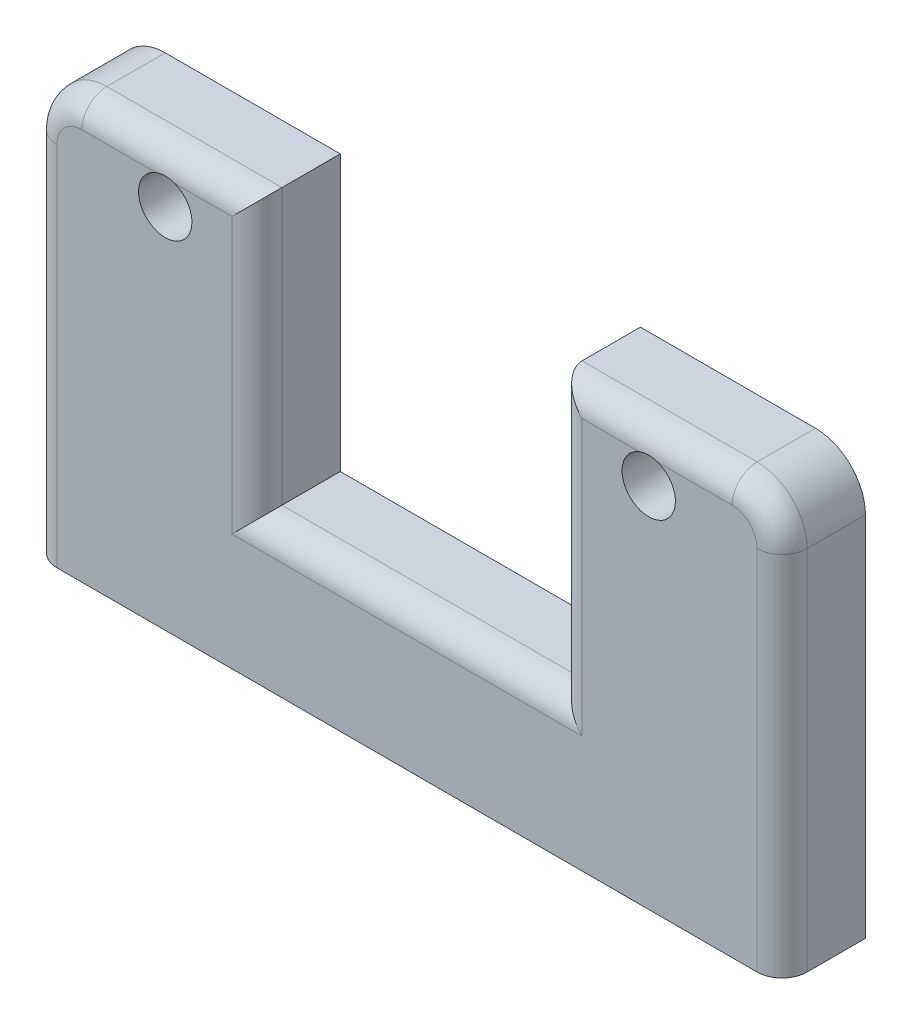
ISO-10303-21;
HEADER;
FILE_DESCRIPTION(('STEP AP214'),'2;1');
FILE_NAME('part.step','',(''),(''),'','','');
FILE_SCHEMA(('AUTOMOTIVE_DESIGN { 1 0 10303 214 1 1 1 1 }'));
ENDSEC;
DATA;
#1=APPLICATION_CONTEXT('core data for automotive mechanical design processes');
#2=APPLICATION_PROTOCOL_DEFINITION('international standard','automotive_design',2000,#1);
#3=PRODUCT_CONTEXT('',#1,'mechanical');
#4=PRODUCT('Part','Part','',(#3));
#5=PRODUCT_RELATED_PRODUCT_CATEGORY('part','',(#4));
#6=PRODUCT_DEFINITION_FORMATION('','',#4);
#7=PRODUCT_DEFINITION_CONTEXT('part definition',#1,'design');
#8=PRODUCT_DEFINITION('design','',#6,#7);
#9=PRODUCT_DEFINITION_SHAPE('','',#8);
#10=(LENGTH_UNIT() NAMED_UNIT(*) SI_UNIT(.MILLI.,.METRE.));
#11=(NAMED_UNIT(*) PLANE_ANGLE_UNIT() SI_UNIT($,.RADIAN.));
#12=(NAMED_UNIT(*) SI_UNIT($,.STERADIAN.) SOLID_ANGLE_UNIT());
#13=UNCERTAINTY_MEASURE_WITH_UNIT(LENGTH_MEASURE(1.E-05),#10,'distance_accuracy_value','');
#14=(GEOMETRIC_REPRESENTATION_CONTEXT(3) GLOBAL_UNCERTAINTY_ASSIGNED_CONTEXT((#13)) GLOBAL_UNIT_ASSIGNED_CONTEXT((#10,
#11,#12)) REPRESENTATION_CONTEXT('',''));
#15=CARTESIAN_POINT('',(0.,0.,0.));
#16=DIRECTION('',(0.,0.,1.));
#17=DIRECTION('',(1.,0.,0.));
#18=AXIS2_PLACEMENT_3D('',#15,#16,#17);
#19=CARTESIAN_POINT('',(241.119901235779,234.095927438084,5.));
#20=DIRECTION('',(0.,0.,1.));
#21=DIRECTION('',(1.,0.,0.));
#22=AXIS2_PLACEMENT_3D('',#19,#20,#21);
#23=PLANE('',#22);
#24=CARTESIAN_POINT('',(275.119901235779,234.095927438084,5.));
#25=DIRECTION('',(0.,0.,1.));
#26=DIRECTION('',(1.,0.,0.));
#27=AXIS2_PLACEMENT_3D('',#24,#25,#26);
#28=CIRCLE('',#27,1.59999999999999);
#29=CARTESIAN_POINT('',(274.563124799497,235.595927438084,5.));
#30=VERTEX_POINT('',#29);
#31=CARTESIAN_POINT('',(275.676677672062,235.595927438084,5.));
#32=VERTEX_POINT('',#31);
#33=EDGE_CURVE('E604',#30,#32,#28,.T.);
#34=ORIENTED_EDGE('',*,*,#33,.F.);
#35=DIRECTION('',(-1.,0.,0.));
#36=VECTOR('',#35,1.);
#37=CARTESIAN_POINT('',(269.619901235779,235.595927438084,5.));
#38=LINE('',#37,#36);
#39=CARTESIAN_POINT('',(271.119901235779,235.595927438084,5.));
#40=VERTEX_POINT('',#39);
#41=EDGE_CURVE('E249',#30,#40,#38,.T.);
#42=ORIENTED_EDGE('',*,*,#41,.T.);
#43=DIRECTION('',(0.,-1.,0.));
#44=VECTOR('',#43,1.);
#45=CARTESIAN_POINT('',(271.119901235779,220.595927438084,5.));
#46=LINE('',#45,#44);
#47=CARTESIAN_POINT('',(271.119901235779,219.095927438084,5.));
#48=VERTEX_POINT('',#47);
#49=EDGE_CURVE('E245',#40,#48,#46,.T.);
#50=ORIENTED_EDGE('',*,*,#49,.T.);
#51=DIRECTION('',(-1.,0.,0.));
#52=VECTOR('',#51,1.);
#53=CARTESIAN_POINT('',(251.619901235779,219.095927438084,5.));
#54=LINE('',#53,#52);
#55=CARTESIAN_POINT('',(250.119901235779,219.095927438084,5.));
#56=VERTEX_POINT('',#55);
#57=EDGE_CURVE('E243',#48,#56,#54,.T.);
#58=ORIENTED_EDGE('',*,*,#57,.T.);
#59=DIRECTION('',(0.,1.,0.));
#60=VECTOR('',#59,1.);
#61=CARTESIAN_POINT('',(250.119901235779,237.095927438084,5.));
#62=LINE('',#61,#60);
#63=CARTESIAN_POINT('',(250.119901235779,235.595927438084,5.));
#64=VERTEX_POINT('',#63);
#65=EDGE_CURVE('E241',#56,#64,#62,.T.);
#66=ORIENTED_EDGE('',*,*,#65,.T.);
#67=DIRECTION('',(-1.,0.,0.));
#68=VECTOR('',#67,1.);
#69=CARTESIAN_POINT('',(241.119901235779,235.595927438084,5.));
#70=LINE('',#69,#68);
#71=CARTESIAN_POINT('',(246.676677672062,235.595927438084,5.));
#72=VERTEX_POINT('',#71);
#73=EDGE_CURVE('E247',#64,#72,#70,.T.);
#74=ORIENTED_EDGE('',*,*,#73,.T.);
#75=CARTESIAN_POINT('',(246.11990123578,234.095927438084,5.));
#76=DIRECTION('',(0.,0.,1.));
#77=DIRECTION('',(1.,0.,0.));
#78=AXIS2_PLACEMENT_3D('',#75,#76,#77);
#79=CIRCLE('',#78,1.59999999999999);
#80=CARTESIAN_POINT('',(245.563124799497,235.595927438084,5.));
#81=VERTEX_POINT('',#80);
#82=EDGE_CURVE('E183',#81,#72,#79,.T.);
#83=ORIENTED_EDGE('',*,*,#82,.F.);
#84=DIRECTION('',(-1.,0.,0.));
#85=VECTOR('',#84,1.);
#86=CARTESIAN_POINT('',(241.119901235779,235.595927438084,5.));
#87=LINE('',#86,#85);
#88=CARTESIAN_POINT('',(241.119901235779,235.595927438084,5.));
#89=VERTEX_POINT('',#88);
#90=EDGE_CURVE('E232',#81,#89,#87,.T.);
#91=ORIENTED_EDGE('',*,*,#90,.T.);
#92=CARTESIAN_POINT('',(241.119901235779,234.095927438084,5.));
#93=DIRECTION('',(0.,0.,1.));
#94=DIRECTION('',(1.,0.,0.));
#95=AXIS2_PLACEMENT_3D('',#92,#93,#94);
#96=CIRCLE('',#95,1.5);
#97=CARTESIAN_POINT('',(239.619901235779,234.095927438084,5.));
#98=VERTEX_POINT('',#97);
#99=EDGE_CURVE('E230',#89,#98,#96,.T.);
#100=ORIENTED_EDGE('',*,*,#99,.T.);
#101=DIRECTION('',(0.,-1.,0.));
#102=VECTOR('',#101,1.);
#103=CARTESIAN_POINT('',(239.619901235779,212.095927438084,5.));
#104=LINE('',#103,#102);
#105=CARTESIAN_POINT('',(239.619901235779,212.095927438084,5.));
#106=VERTEX_POINT('',#105);
#107=EDGE_CURVE('E166',#98,#106,#104,.T.);
#108=ORIENTED_EDGE('',*,*,#107,.T.);
#109=DIRECTION('',(1.,0.,0.));
#110=VECTOR('',#109,1.);
#111=CARTESIAN_POINT('',(238.119901235779,212.095927438084,5.));
#112=LINE('',#111,#110);
#113=CARTESIAN_POINT('',(281.619901235779,212.095927438084,5.));
#114=VERTEX_POINT('',#113);
#115=EDGE_CURVE('E189',#106,#114,#112,.T.);
#116=ORIENTED_EDGE('',*,*,#115,.T.);
#117=DIRECTION('',(0.,1.,0.));
#118=VECTOR('',#117,1.);
#119=CARTESIAN_POINT('',(281.619901235779,234.095927438084,5.));
#120=LINE('',#119,#118);
#121=CARTESIAN_POINT('',(281.619901235779,234.095927438084,5.));
#122=VERTEX_POINT('',#121);
#123=EDGE_CURVE('E234',#114,#122,#120,.T.);
#124=ORIENTED_EDGE('',*,*,#123,.T.);
#125=CARTESIAN_POINT('',(280.11990123578,234.095927438084,5.));
#126=DIRECTION('',(0.,0.,1.));
#127=DIRECTION('',(1.,0.,0.));
#128=AXIS2_PLACEMENT_3D('',#125,#126,#127);
#129=CIRCLE('',#128,1.49999999999997);
#130=CARTESIAN_POINT('',(280.11990123578,235.595927438084,5.));
#131=VERTEX_POINT('',#130);
#132=EDGE_CURVE('E236',#122,#131,#129,.T.);
#133=ORIENTED_EDGE('',*,*,#132,.T.);
#134=DIRECTION('',(-1.,0.,0.));
#135=VECTOR('',#134,1.);
#136=CARTESIAN_POINT('',(269.619901235779,235.595927438084,5.));
#137=LINE('',#136,#135);
#138=EDGE_CURVE('E238',#131,#32,#137,.T.);
#139=ORIENTED_EDGE('',*,*,#138,.T.);
#140=EDGE_LOOP('',(#34,#42,#50,#58,#66,#74,#83,#91,#100,#108,#116,#124,#133,#139));
#141=FACE_BOUND('',#140,.T.);
#142=ADVANCED_FACE('F35',(#141),#23,.T.);
#143=CARTESIAN_POINT('',(241.119901235779,234.095927438084,0.));
#144=DIRECTION('',(0.,0.,1.));
#145=DIRECTION('',(1.,0.,0.));
#146=AXIS2_PLACEMENT_3D('',#143,#144,#145);
#147=PLANE('',#146);
#148=CARTESIAN_POINT('',(241.119901235779,234.095927438084,0.));
#149=DIRECTION('',(0.,0.,1.));
#150=DIRECTION('',(1.,0.,0.));
#151=AXIS2_PLACEMENT_3D('',#148,#149,#150);
#152=CIRCLE('',#151,3.);
#153=CARTESIAN_POINT('',(241.119901235779,237.095927438084,0.));
#154=VERTEX_POINT('',#153);
#155=CARTESIAN_POINT('',(238.119901235779,234.095927438084,0.));
#156=VERTEX_POINT('',#155);
#157=EDGE_CURVE('E174',#154,#156,#152,.T.);
#158=ORIENTED_EDGE('',*,*,#157,.F.);
#159=DIRECTION('',(-1.,0.,0.));
#160=VECTOR('',#159,1.);
#161=CARTESIAN_POINT('',(241.119901235779,237.095927438084,0.));
#162=LINE('',#161,#160);
#163=CARTESIAN_POINT('',(251.619901235779,237.095927438084,0.));
#164=VERTEX_POINT('',#163);
#165=EDGE_CURVE('E211',#164,#154,#162,.T.);
#166=ORIENTED_EDGE('',*,*,#165,.F.);
#167=DIRECTION('',(0.,1.,0.));
#168=VECTOR('',#167,1.);
#169=CARTESIAN_POINT('',(251.619901235779,237.095927438084,0.));
#170=LINE('',#169,#168);
#171=CARTESIAN_POINT('',(251.619901235779,220.595927438084,0.));
#172=VERTEX_POINT('',#171);
#173=EDGE_CURVE('E208',#172,#164,#170,.T.);
#174=ORIENTED_EDGE('',*,*,#173,.F.);
#175=DIRECTION('',(-1.,0.,0.));
#176=VECTOR('',#175,1.);
#177=CARTESIAN_POINT('',(251.619901235779,220.595927438084,0.));
#178=LINE('',#177,#176);
#179=CARTESIAN_POINT('',(269.619901235779,220.595927438084,0.));
#180=VERTEX_POINT('',#179);
#181=EDGE_CURVE('E205',#180,#172,#178,.T.);
#182=ORIENTED_EDGE('',*,*,#181,.F.);
#183=DIRECTION('',(0.,-1.,0.));
#184=VECTOR('',#183,1.);
#185=CARTESIAN_POINT('',(269.619901235779,237.095927438084,0.));
#186=LINE('',#185,#184);
#187=CARTESIAN_POINT('',(269.619901235779,237.095927438084,0.));
#188=VERTEX_POINT('',#187);
#189=EDGE_CURVE('E202',#188,#180,#186,.T.);
#190=ORIENTED_EDGE('',*,*,#189,.F.);
#191=DIRECTION('',(-1.,0.,0.));
#192=VECTOR('',#191,1.);
#193=CARTESIAN_POINT('',(280.11990123578,237.095927438084,0.));
#194=LINE('',#193,#192);
#195=CARTESIAN_POINT('',(280.11990123578,237.095927438084,0.));
#196=VERTEX_POINT('',#195);
#197=EDGE_CURVE('E199',#196,#188,#194,.T.);
#198=ORIENTED_EDGE('',*,*,#197,.F.);
#199=CARTESIAN_POINT('',(280.11990123578,234.095927438084,0.));
#200=DIRECTION('',(0.,0.,1.));
#201=DIRECTION('',(1.,0.,0.));
#202=AXIS2_PLACEMENT_3D('',#199,#200,#201);
#203=CIRCLE('',#202,2.99999999999998);
#204=CARTESIAN_POINT('',(283.119901235779,234.095927438084,0.));
#205=VERTEX_POINT('',#204);
#206=EDGE_CURVE('E196',#205,#196,#203,.T.);
#207=ORIENTED_EDGE('',*,*,#206,.F.);
#208=DIRECTION('',(0.,1.,0.));
#209=VECTOR('',#208,1.);
#210=CARTESIAN_POINT('',(283.119901235779,212.095927438084,0.));
#211=LINE('',#210,#209);
#212=CARTESIAN_POINT('',(283.119901235779,212.095927438084,0.));
#213=VERTEX_POINT('',#212);
#214=EDGE_CURVE('E193',#213,#205,#211,.T.);
#215=ORIENTED_EDGE('',*,*,#214,.F.);
#216=DIRECTION('',(1.,0.,0.));
#217=VECTOR('',#216,1.);
#218=CARTESIAN_POINT('',(238.119901235779,212.095927438084,0.));
#219=LINE('',#218,#217);
#220=CARTESIAN_POINT('',(238.119901235779,212.095927438084,0.));
#221=VERTEX_POINT('',#220);
#222=EDGE_CURVE('E177',#221,#213,#219,.T.);
#223=ORIENTED_EDGE('',*,*,#222,.F.);
#224=DIRECTION('',(0.,-1.,0.));
#225=VECTOR('',#224,1.);
#226=CARTESIAN_POINT('',(238.119901235779,212.095927438084,0.));
#227=LINE('',#226,#225);
#228=EDGE_CURVE('E160',#156,#221,#227,.T.);
#229=ORIENTED_EDGE('',*,*,#228,.F.);
#230=EDGE_LOOP('',(#158,#166,#174,#182,#190,#198,#207,#215,#223,#229));
#231=FACE_BOUND('',#230,.T.);
#232=CARTESIAN_POINT('',(246.11990123578,234.095927438084,0.));
#233=DIRECTION('',(0.,0.,1.));
#234=DIRECTION('',(1.,0.,0.));
#235=AXIS2_PLACEMENT_3D('',#232,#233,#234);
#236=CIRCLE('',#235,1.59999999999999);
#237=CARTESIAN_POINT('',(247.71990123578,234.095927438084,0.));
#238=VERTEX_POINT('',#237);
#239=EDGE_CURVE('E186',#238,#238,#236,.T.);
#240=ORIENTED_EDGE('',*,*,#239,.T.);
#241=EDGE_LOOP('',(#240));
#242=FACE_BOUND('',#241,.T.);
#243=CARTESIAN_POINT('',(275.119901235779,234.095927438084,0.));
#244=DIRECTION('',(0.,0.,1.));
#245=DIRECTION('',(1.,0.,0.));
#246=AXIS2_PLACEMENT_3D('',#243,#244,#245);
#247=CIRCLE('',#246,1.59999999999999);
#248=CARTESIAN_POINT('',(276.71990123578,234.095927438084,0.));
#249=VERTEX_POINT('',#248);
#250=EDGE_CURVE('E606',#249,#249,#247,.T.);
#251=ORIENTED_EDGE('',*,*,#250,.T.);
#252=EDGE_LOOP('',(#251));
#253=FACE_BOUND('',#252,.T.);
#254=ADVANCED_FACE('F171',(#231,#242,#253),#147,.F.);
#255=CARTESIAN_POINT('',(241.119901235779,234.095927438084,5.));
#256=DIRECTION('',(0.,0.,-1.));
#257=DIRECTION('',(-1.,0.,0.));
#258=AXIS2_PLACEMENT_3D('',#255,#256,#257);
#259=CYLINDRICAL_SURFACE('',#258,3.);
#260=DIRECTION('',(0.,0.,-1.));
#261=VECTOR('',#260,1.);
#262=CARTESIAN_POINT('',(238.119901235779,234.095927438084,5.));
#263=LINE('',#262,#261);
#264=CARTESIAN_POINT('',(238.119901235779,234.095927438084,3.5));
#265=VERTEX_POINT('',#264);
#266=EDGE_CURVE('E157',#265,#156,#263,.T.);
#267=ORIENTED_EDGE('',*,*,#266,.F.);
#268=CARTESIAN_POINT('',(241.119901235779,234.095927438084,3.5));
#269=DIRECTION('',(0.,0.,1.));
#270=DIRECTION('',(1.,0.,0.));
#271=AXIS2_PLACEMENT_3D('',#268,#269,#270);
#272=CIRCLE('',#271,3.);
#273=CARTESIAN_POINT('',(241.119901235779,237.095927438084,3.5));
#274=VERTEX_POINT('',#273);
#275=EDGE_CURVE('E535',#265,#274,#272,.F.);
#276=ORIENTED_EDGE('',*,*,#275,.T.);
#277=DIRECTION('',(0.,0.,-1.));
#278=VECTOR('',#277,1.);
#279=CARTESIAN_POINT('',(241.119901235779,237.095927438084,5.));
#280=LINE('',#279,#278);
#281=EDGE_CURVE('E181',#274,#154,#280,.T.);
#282=ORIENTED_EDGE('',*,*,#281,.T.);
#283=ORIENTED_EDGE('',*,*,#157,.T.);
#284=EDGE_LOOP('',(#267,#276,#282,#283));
#285=FACE_BOUND('',#284,.T.);
#286=ADVANCED_FACE('F179',(#285),#259,.T.);
#287=CARTESIAN_POINT('',(238.119901235779,212.095927438084,5.));
#288=DIRECTION('',(1.,0.,0.));
#289=DIRECTION('',(0.,0.,-1.));
#290=AXIS2_PLACEMENT_3D('',#287,#288,#289);
#291=PLANE('',#290);
#292=DIRECTION('',(0.,0.,-1.));
#293=VECTOR('',#292,1.);
#294=CARTESIAN_POINT('',(238.119901235779,212.095927438084,5.));
#295=LINE('',#294,#293);
#296=CARTESIAN_POINT('',(238.119901235779,212.095927438084,3.5));
#297=VERTEX_POINT('',#296);
#298=EDGE_CURVE('E167',#297,#221,#295,.T.);
#299=ORIENTED_EDGE('',*,*,#298,.F.);
#300=DIRECTION('',(0.,-1.,0.));
#301=VECTOR('',#300,1.);
#302=CARTESIAN_POINT('',(238.119901235779,234.095927438084,3.5));
#303=LINE('',#302,#301);
#304=EDGE_CURVE('E11',#297,#265,#303,.F.);
#305=ORIENTED_EDGE('',*,*,#304,.T.);
#306=ORIENTED_EDGE('',*,*,#266,.T.);
#307=ORIENTED_EDGE('',*,*,#228,.T.);
#308=EDGE_LOOP('',(#299,#305,#306,#307));
#309=FACE_BOUND('',#308,.T.);
#310=ADVANCED_FACE('F159',(#309),#291,.F.);
#311=CARTESIAN_POINT('',(238.119901235779,212.095927438084,5.));
#312=DIRECTION('',(0.,1.,0.));
#313=DIRECTION('',(0.,0.,1.));
#314=AXIS2_PLACEMENT_3D('',#311,#312,#313);
#315=PLANE('',#314);
#316=CARTESIAN_POINT('',(279.86990123578,212.095927438084,2.5));
#317=DIRECTION('',(0.,-1.,0.));
#318=DIRECTION('',(0.,0.,-1.));
#319=AXIS2_PLACEMENT_3D('',#316,#317,#318);
#320=CIRCLE('',#319,1.25000000000001);
#321=CARTESIAN_POINT('',(279.86990123578,212.095927438084,1.24999999999999));
#322=VERTEX_POINT('',#321);
#323=EDGE_CURVE('E537',#322,#322,#320,.T.);
#324=ORIENTED_EDGE('',*,*,#323,.F.);
#325=EDGE_LOOP('',(#324));
#326=FACE_BOUND('',#325,.T.);
#327=CARTESIAN_POINT('',(241.36990123578,212.095927438084,2.5));
#328=DIRECTION('',(0.,-1.,0.));
#329=DIRECTION('',(0.,0.,-1.));
#330=AXIS2_PLACEMENT_3D('',#327,#328,#329);
#331=CIRCLE('',#330,1.25000000000001);
#332=CARTESIAN_POINT('',(241.36990123578,212.095927438084,1.24999999999999));
#333=VERTEX_POINT('',#332);
#334=EDGE_CURVE('E613',#333,#333,#331,.T.);
#335=ORIENTED_EDGE('',*,*,#334,.F.);
#336=EDGE_LOOP('',(#335));
#337=FACE_BOUND('',#336,.T.);
#338=DIRECTION('',(0.,0.,-1.));
#339=VECTOR('',#338,1.);
#340=CARTESIAN_POINT('',(283.119901235779,212.095927438084,5.));
#341=LINE('',#340,#339);
#342=CARTESIAN_POINT('',(283.119901235779,212.095927438084,3.5));
#343=VERTEX_POINT('',#342);
#344=EDGE_CURVE('E226',#343,#213,#341,.T.);
#345=ORIENTED_EDGE('',*,*,#344,.F.);
#346=CARTESIAN_POINT('',(281.619901235779,212.095927438084,3.5));
#347=DIRECTION('',(0.,1.,0.));
#348=DIRECTION('',(0.,0.,1.));
#349=AXIS2_PLACEMENT_3D('',#346,#347,#348);
#350=CIRCLE('',#349,1.5);
#351=EDGE_CURVE('E44',#343,#114,#350,.F.);
#352=ORIENTED_EDGE('',*,*,#351,.T.);
#353=ORIENTED_EDGE('',*,*,#115,.F.);
#354=CARTESIAN_POINT('',(239.619901235779,212.095927438084,3.5));
#355=DIRECTION('',(0.,1.,0.));
#356=DIRECTION('',(0.,0.,1.));
#357=AXIS2_PLACEMENT_3D('',#354,#355,#356);
#358=CIRCLE('',#357,1.5);
#359=EDGE_CURVE('E52',#106,#297,#358,.F.);
#360=ORIENTED_EDGE('',*,*,#359,.T.);
#361=ORIENTED_EDGE('',*,*,#298,.T.);
#362=ORIENTED_EDGE('',*,*,#222,.T.);
#363=EDGE_LOOP('',(#345,#352,#353,#360,#361,#362));
#364=FACE_BOUND('',#363,.T.);
#365=ADVANCED_FACE('F342',(#326,#337,#364),#315,.F.);
#366=CARTESIAN_POINT('',(283.119901235779,212.095927438084,5.));
#367=DIRECTION('',(-1.,0.,0.));
#368=DIRECTION('',(0.,0.,1.));
#369=AXIS2_PLACEMENT_3D('',#366,#367,#368);
#370=PLANE('',#369);
#371=DIRECTION('',(0.,0.,-1.));
#372=VECTOR('',#371,1.);
#373=CARTESIAN_POINT('',(283.119901235779,234.095927438084,5.));
#374=LINE('',#373,#372);
#375=CARTESIAN_POINT('',(283.119901235779,234.095927438084,3.5));
#376=VERTEX_POINT('',#375);
#377=EDGE_CURVE('E224',#376,#205,#374,.T.);
#378=ORIENTED_EDGE('',*,*,#377,.F.);
#379=DIRECTION('',(0.,1.,0.));
#380=VECTOR('',#379,1.);
#381=CARTESIAN_POINT('',(283.119901235779,212.095927438084,3.5));
#382=LINE('',#381,#380);
#383=EDGE_CURVE('E60',#376,#343,#382,.F.);
#384=ORIENTED_EDGE('',*,*,#383,.T.);
#385=ORIENTED_EDGE('',*,*,#344,.T.);
#386=ORIENTED_EDGE('',*,*,#214,.T.);
#387=EDGE_LOOP('',(#378,#384,#385,#386));
#388=FACE_BOUND('',#387,.T.);
#389=ADVANCED_FACE('F338',(#388),#370,.F.);
#390=CARTESIAN_POINT('',(280.11990123578,234.095927438084,5.));
#391=DIRECTION('',(0.,0.,-1.));
#392=DIRECTION('',(-1.,0.,0.));
#393=AXIS2_PLACEMENT_3D('',#390,#391,#392);
#394=CYLINDRICAL_SURFACE('',#393,2.99999999999998);
#395=DIRECTION('',(0.,0.,-1.));
#396=VECTOR('',#395,1.);
#397=CARTESIAN_POINT('',(280.11990123578,237.095927438084,5.));
#398=LINE('',#397,#396);
#399=CARTESIAN_POINT('',(280.11990123578,237.095927438084,3.5));
#400=VERTEX_POINT('',#399);
#401=EDGE_CURVE('E222',#400,#196,#398,.T.);
#402=ORIENTED_EDGE('',*,*,#401,.F.);
#403=CARTESIAN_POINT('',(280.11990123578,234.095927438084,3.5));
#404=DIRECTION('',(0.,0.,1.));
#405=DIRECTION('',(1.,0.,0.));
#406=AXIS2_PLACEMENT_3D('',#403,#404,#405);
#407=CIRCLE('',#406,2.99999999999998);
#408=EDGE_CURVE('E303',#400,#376,#407,.F.);
#409=ORIENTED_EDGE('',*,*,#408,.T.);
#410=ORIENTED_EDGE('',*,*,#377,.T.);
#411=ORIENTED_EDGE('',*,*,#206,.T.);
#412=EDGE_LOOP('',(#402,#409,#410,#411));
#413=FACE_BOUND('',#412,.T.);
#414=ADVANCED_FACE('F334',(#413),#394,.T.);
#415=CARTESIAN_POINT('',(280.11990123578,237.095927438084,5.));
#416=DIRECTION('',(0.,-1.,0.));
#417=DIRECTION('',(1.,0.,0.));
#418=AXIS2_PLACEMENT_3D('',#415,#416,#417);
#419=PLANE('',#418);
#420=DIRECTION('',(0.,0.,-1.));
#421=VECTOR('',#420,1.);
#422=CARTESIAN_POINT('',(269.619901235779,237.095927438084,5.));
#423=LINE('',#422,#421);
#424=CARTESIAN_POINT('',(269.619901235779,237.095927438084,3.5));
#425=VERTEX_POINT('',#424);
#426=EDGE_CURVE('E220',#425,#188,#423,.T.);
#427=ORIENTED_EDGE('',*,*,#426,.F.);
#428=DIRECTION('',(-1.,0.,0.));
#429=VECTOR('',#428,1.);
#430=CARTESIAN_POINT('',(280.11990123578,237.095927438084,3.5));
#431=LINE('',#430,#429);
#432=EDGE_CURVE('E258',#425,#400,#431,.F.);
#433=ORIENTED_EDGE('',*,*,#432,.T.);
#434=ORIENTED_EDGE('',*,*,#401,.T.);
#435=ORIENTED_EDGE('',*,*,#197,.T.);
#436=EDGE_LOOP('',(#427,#433,#434,#435));
#437=FACE_BOUND('',#436,.T.);
#438=ADVANCED_FACE('F330',(#437),#419,.F.);
#439=CARTESIAN_POINT('',(269.619901235779,237.095927438084,5.));
#440=DIRECTION('',(1.,0.,0.));
#441=DIRECTION('',(0.,0.,-1.));
#442=AXIS2_PLACEMENT_3D('',#439,#440,#441);
#443=PLANE('',#442);
#444=DIRECTION('',(0.,0.,-1.));
#445=VECTOR('',#444,1.);
#446=CARTESIAN_POINT('',(269.619901235779,220.595927438084,5.));
#447=LINE('',#446,#445);
#448=CARTESIAN_POINT('',(269.619901235779,220.595927438084,3.5));
#449=VERTEX_POINT('',#448);
#450=EDGE_CURVE('E218',#449,#180,#447,.T.);
#451=ORIENTED_EDGE('',*,*,#450,.F.);
#452=DIRECTION('',(0.,-1.,0.));
#453=VECTOR('',#452,1.);
#454=CARTESIAN_POINT('',(269.619901235779,237.095927438084,3.5));
#455=LINE('',#454,#453);
#456=EDGE_CURVE('E570',#449,#425,#455,.F.);
#457=ORIENTED_EDGE('',*,*,#456,.T.);
#458=ORIENTED_EDGE('',*,*,#426,.T.);
#459=ORIENTED_EDGE('',*,*,#189,.T.);
#460=EDGE_LOOP('',(#451,#457,#458,#459));
#461=FACE_BOUND('',#460,.T.);
#462=ADVANCED_FACE('F326',(#461),#443,.F.);
#463=CARTESIAN_POINT('',(251.619901235779,220.595927438084,5.));
#464=DIRECTION('',(0.,-1.,0.));
#465=DIRECTION('',(0.,0.,-1.));
#466=AXIS2_PLACEMENT_3D('',#463,#464,#465);
#467=PLANE('',#466);
#468=DIRECTION('',(0.,0.,-1.));
#469=VECTOR('',#468,1.);
#470=CARTESIAN_POINT('',(251.619901235779,220.595927438084,5.));
#471=LINE('',#470,#469);
#472=CARTESIAN_POINT('',(251.619901235779,220.595927438084,3.5));
#473=VERTEX_POINT('',#472);
#474=EDGE_CURVE('E216',#473,#172,#471,.T.);
#475=ORIENTED_EDGE('',*,*,#474,.F.);
#476=DIRECTION('',(-1.,0.,0.));
#477=VECTOR('',#476,1.);
#478=CARTESIAN_POINT('',(269.619901235779,220.595927438084,3.5));
#479=LINE('',#478,#477);
#480=EDGE_CURVE('E568',#473,#449,#479,.F.);
#481=ORIENTED_EDGE('',*,*,#480,.T.);
#482=ORIENTED_EDGE('',*,*,#450,.T.);
#483=ORIENTED_EDGE('',*,*,#181,.T.);
#484=EDGE_LOOP('',(#475,#481,#482,#483));
#485=FACE_BOUND('',#484,.T.);
#486=ADVANCED_FACE('F322',(#485),#467,.F.);
#487=CARTESIAN_POINT('',(251.619901235779,237.095927438084,5.));
#488=DIRECTION('',(-1.,0.,0.));
#489=DIRECTION('',(0.,0.,1.));
#490=AXIS2_PLACEMENT_3D('',#487,#488,#489);
#491=PLANE('',#490);
#492=DIRECTION('',(0.,0.,-1.));
#493=VECTOR('',#492,1.);
#494=CARTESIAN_POINT('',(251.619901235779,237.095927438084,5.));
#495=LINE('',#494,#493);
#496=CARTESIAN_POINT('',(251.619901235779,237.095927438084,3.5));
#497=VERTEX_POINT('',#496);
#498=EDGE_CURVE('E214',#497,#164,#495,.T.);
#499=ORIENTED_EDGE('',*,*,#498,.F.);
#500=DIRECTION('',(0.,1.,0.));
#501=VECTOR('',#500,1.);
#502=CARTESIAN_POINT('',(251.619901235779,220.595927438084,3.5));
#503=LINE('',#502,#501);
#504=EDGE_CURVE('E566',#497,#473,#503,.F.);
#505=ORIENTED_EDGE('',*,*,#504,.T.);
#506=ORIENTED_EDGE('',*,*,#474,.T.);
#507=ORIENTED_EDGE('',*,*,#173,.T.);
#508=EDGE_LOOP('',(#499,#505,#506,#507));
#509=FACE_BOUND('',#508,.T.);
#510=ADVANCED_FACE('F318',(#509),#491,.F.);
#511=CARTESIAN_POINT('',(241.119901235779,237.095927438084,5.));
#512=DIRECTION('',(0.,-1.,0.));
#513=DIRECTION('',(0.,0.,-1.));
#514=AXIS2_PLACEMENT_3D('',#511,#512,#513);
#515=PLANE('',#514);
#516=ORIENTED_EDGE('',*,*,#281,.F.);
#517=DIRECTION('',(-1.,0.,0.));
#518=VECTOR('',#517,1.);
#519=CARTESIAN_POINT('',(251.619901235779,237.095927438084,3.5));
#520=LINE('',#519,#518);
#521=EDGE_CURVE('E302',#274,#497,#520,.F.);
#522=ORIENTED_EDGE('',*,*,#521,.T.);
#523=ORIENTED_EDGE('',*,*,#498,.T.);
#524=ORIENTED_EDGE('',*,*,#165,.T.);
#525=EDGE_LOOP('',(#516,#522,#523,#524));
#526=FACE_BOUND('',#525,.T.);
#527=ADVANCED_FACE('F309',(#526),#515,.F.);
#528=CARTESIAN_POINT('',(246.11990123578,234.095927438084,5.));
#529=DIRECTION('',(0.,0.,-1.));
#530=DIRECTION('',(-1.,0.,0.));
#531=AXIS2_PLACEMENT_3D('',#528,#529,#530);
#532=CYLINDRICAL_SURFACE('',#531,1.59999999999999);
#533=ORIENTED_EDGE('',*,*,#82,.T.);
#534=CARTESIAN_POINT('',(246.676677672062,235.595927438084,5.));
#535=CARTESIAN_POINT('',(246.633901419943,235.611810710577,4.99998628050601));
#536=CARTESIAN_POINT('',(246.59044413893,235.625854111346,4.99974708781376));
#537=CARTESIAN_POINT('',(246.502496808462,235.650178895589,4.99907168670408));
#538=CARTESIAN_POINT('',(246.458006902506,235.660460798492,4.99863550550759));
#539=CARTESIAN_POINT('',(246.369615588009,235.67694161627,4.99783177091119));
#540=CARTESIAN_POINT('',(246.325734679962,235.683250554361,4.99746259085897));
#541=CARTESIAN_POINT('',(246.237599281442,235.692207213984,4.99691380136298));
#542=CARTESIAN_POINT('',(246.193344781574,235.694854843169,4.99673419670081));
#543=CARTESIAN_POINT('',(246.10006276081,235.696554454611,4.99662147929318));
#544=CARTESIAN_POINT('',(246.051027177782,235.695194977928,4.99671655185866));
#545=CARTESIAN_POINT('',(245.953282580389,235.687983006653,4.99717647720257));
#546=CARTESIAN_POINT('',(245.904573622961,235.682129748242,4.99754137584354));
#547=CARTESIAN_POINT('',(245.806296112515,235.665708757105,4.99840079163312));
#548=CARTESIAN_POINT('',(245.756752548449,235.654991250043,4.998899202734));
#549=CARTESIAN_POINT('',(245.658900985428,235.628914487378,4.99968823976701));
#550=CARTESIAN_POINT('',(245.610592991187,235.61355521407,4.99997886490658));
#551=CARTESIAN_POINT('',(245.563124799497,235.595927438084,5.));
#552=B_SPLINE_CURVE_WITH_KNOTS('',3,(#534,#535,#536,#537,#538,#539,#540,#541,#542,#543,#544,
#545,#546,#547,#548,#549,#550,#551),.UNSPECIFIED.,.F.,.F.,(4,2,2,2,2,2,2,2,4),(0.,
0.136845221079914,0.273671537926004,0.406519543081961,0.539370898943245,0.686322764778767,
0.83329961387208,0.985146088564049,1.13699314243398),.UNSPECIFIED.);
#553=EDGE_CURVE('E297',#72,#81,#552,.T.);
#554=ORIENTED_EDGE('',*,*,#553,.T.);
#555=EDGE_LOOP('',(#533,#554));
#556=FACE_BOUND('',#555,.T.);
#557=ORIENTED_EDGE('',*,*,#239,.F.);
#558=EDGE_LOOP('',(#557));
#559=FACE_BOUND('',#558,.T.);
#560=ADVANCED_FACE('F305',(#556,#559),#532,.F.);
#561=CARTESIAN_POINT('',(275.119901235779,234.095927438084,5.));
#562=DIRECTION('',(0.,0.,-1.));
#563=DIRECTION('',(-1.,0.,0.));
#564=AXIS2_PLACEMENT_3D('',#561,#562,#563);
#565=CYLINDRICAL_SURFACE('',#564,1.59999999999999);
#566=ORIENTED_EDGE('',*,*,#33,.T.);
#567=CARTESIAN_POINT('',(275.676677672062,235.595927438084,5.));
#568=CARTESIAN_POINT('',(275.633901419943,235.611810710577,4.99998628050601));
#569=CARTESIAN_POINT('',(275.59044413893,235.625854111346,4.99974708781376));
#570=CARTESIAN_POINT('',(275.502496808462,235.650178895589,4.99907168670408));
#571=CARTESIAN_POINT('',(275.458006902506,235.660460798492,4.99863550550759));
#572=CARTESIAN_POINT('',(275.369615588009,235.67694161627,4.99783177091119));
#573=CARTESIAN_POINT('',(275.325734679962,235.683250554361,4.99746259085897));
#574=CARTESIAN_POINT('',(275.237599281442,235.692207213984,4.99691380136298));
#575=CARTESIAN_POINT('',(275.193344781574,235.694854843169,4.99673419670081));
#576=CARTESIAN_POINT('',(275.10006276081,235.696554454611,4.99662147929318));
#577=CARTESIAN_POINT('',(275.051027177782,235.695194977928,4.99671655185866));
#578=CARTESIAN_POINT('',(274.953282580389,235.687983006653,4.99717647720257));
#579=CARTESIAN_POINT('',(274.904573622961,235.682129748242,4.99754137584354));
#580=CARTESIAN_POINT('',(274.806296112515,235.665708757105,4.99840079163312));
#581=CARTESIAN_POINT('',(274.756752548449,235.654991250043,4.998899202734));
#582=CARTESIAN_POINT('',(274.658900985428,235.628914487378,4.99968823976701));
#583=CARTESIAN_POINT('',(274.610592991187,235.61355521407,4.99997886490658));
#584=CARTESIAN_POINT('',(274.563124799497,235.595927438084,5.));
#585=B_SPLINE_CURVE_WITH_KNOTS('',3,(#567,#568,#569,#570,#571,#572,#573,#574,#575,#576,#577,
#578,#579,#580,#581,#582,#583,#584),.UNSPECIFIED.,.F.,.F.,(4,2,2,2,2,2,2,2,4),(0.,
0.136845221079941,0.27367153792595,0.406519543081906,0.539370898943218,0.686322764778795,
0.833299613872026,0.985146088563989,1.1369931424339),.UNSPECIFIED.);
#586=EDGE_CURVE('E251',#32,#30,#585,.T.);
#587=ORIENTED_EDGE('',*,*,#586,.T.);
#588=EDGE_LOOP('',(#566,#587));
#589=FACE_BOUND('',#588,.T.);
#590=ORIENTED_EDGE('',*,*,#250,.F.);
#591=EDGE_LOOP('',(#590));
#592=FACE_BOUND('',#591,.T.);
#593=ADVANCED_FACE('F260',(#589,#592),#565,.F.);
#594=CARTESIAN_POINT('',(241.36990123578,218.095927438084,2.5));
#595=DIRECTION('',(0.,-1.,0.));
#596=DIRECTION('',(0.,0.,-1.));
#597=AXIS2_PLACEMENT_3D('',#594,#595,#596);
#598=CYLINDRICAL_SURFACE('',#597,1.25000000000001);
#599=CARTESIAN_POINT('',(241.36990123578,218.095927438084,2.5));
#600=DIRECTION('',(0.,-1.,0.));
#601=DIRECTION('',(0.,0.,-1.));
#602=AXIS2_PLACEMENT_3D('',#599,#600,#601);
#603=CIRCLE('',#602,1.25000000000001);
#604=CARTESIAN_POINT('',(241.36990123578,218.095927438084,1.24999999999999));
#605=VERTEX_POINT('',#604);
#606=EDGE_CURVE('E610',#605,#605,#603,.T.);
#607=ORIENTED_EDGE('',*,*,#606,.F.);
#608=EDGE_LOOP('',(#607));
#609=FACE_BOUND('',#608,.T.);
#610=ORIENTED_EDGE('',*,*,#334,.T.);
#611=EDGE_LOOP('',(#610));
#612=FACE_BOUND('',#611,.T.);
#613=ADVANCED_FACE('F391',(#609,#612),#598,.F.);
#614=CARTESIAN_POINT('',(241.36990123578,218.095927438084,2.5));
#615=DIRECTION('',(0.,-1.,0.));
#616=DIRECTION('',(0.,0.,-1.));
#617=AXIS2_PLACEMENT_3D('',#614,#615,#616);
#618=PLANE('',#617);
#619=ORIENTED_EDGE('',*,*,#606,.T.);
#620=EDGE_LOOP('',(#619));
#621=FACE_BOUND('',#620,.T.);
#622=ADVANCED_FACE('F382',(#621),#618,.T.);
#623=CARTESIAN_POINT('',(279.86990123578,218.095927438084,2.5));
#624=DIRECTION('',(0.,-1.,0.));
#625=DIRECTION('',(0.,0.,-1.));
#626=AXIS2_PLACEMENT_3D('',#623,#624,#625);
#627=CYLINDRICAL_SURFACE('',#626,1.25000000000001);
#628=CARTESIAN_POINT('',(279.86990123578,218.095927438084,2.5));
#629=DIRECTION('',(0.,-1.,0.));
#630=DIRECTION('',(0.,0.,-1.));
#631=AXIS2_PLACEMENT_3D('',#628,#629,#630);
#632=CIRCLE('',#631,1.25000000000001);
#633=CARTESIAN_POINT('',(279.86990123578,218.095927438084,1.24999999999999));
#634=VERTEX_POINT('',#633);
#635=EDGE_CURVE('E540',#634,#634,#632,.T.);
#636=ORIENTED_EDGE('',*,*,#635,.F.);
#637=EDGE_LOOP('',(#636));
#638=FACE_BOUND('',#637,.T.);
#639=ORIENTED_EDGE('',*,*,#323,.T.);
#640=EDGE_LOOP('',(#639));
#641=FACE_BOUND('',#640,.T.);
#642=ADVANCED_FACE('F370',(#638,#641),#627,.F.);
#643=CARTESIAN_POINT('',(279.86990123578,218.095927438084,2.5));
#644=DIRECTION('',(0.,-1.,0.));
#645=DIRECTION('',(0.,0.,-1.));
#646=AXIS2_PLACEMENT_3D('',#643,#644,#645);
#647=PLANE('',#646);
#648=ORIENTED_EDGE('',*,*,#635,.T.);
#649=EDGE_LOOP('',(#648));
#650=FACE_BOUND('',#649,.T.);
#651=ADVANCED_FACE('F365',(#650),#647,.T.);
#652=CARTESIAN_POINT('',(239.619901235779,234.095927438084,3.5));
#653=DIRECTION('',(0.,1.,0.));
#654=DIRECTION('',(0.,0.,1.));
#655=AXIS2_PLACEMENT_3D('',#652,#653,#654);
#656=CYLINDRICAL_SURFACE('',#655,1.5);
#657=ORIENTED_EDGE('',*,*,#359,.F.);
#658=ORIENTED_EDGE('',*,*,#107,.F.);
#659=CARTESIAN_POINT('',(239.619901235779,234.095927438084,3.5));
#660=DIRECTION('',(0.,1.,0.));
#661=DIRECTION('',(0.,0.,1.));
#662=AXIS2_PLACEMENT_3D('',#659,#660,#661);
#663=CIRCLE('',#662,1.5);
#664=EDGE_CURVE('E39',#265,#98,#663,.T.);
#665=ORIENTED_EDGE('',*,*,#664,.F.);
#666=ORIENTED_EDGE('',*,*,#304,.F.);
#667=EDGE_LOOP('',(#657,#658,#665,#666));
#668=FACE_BOUND('',#667,.T.);
#669=ADVANCED_FACE('F37',(#668),#656,.T.);
#670=CARTESIAN_POINT('',(241.119901235779,234.095927438084,3.5));
#671=DIRECTION('',(0.,0.,1.));
#672=DIRECTION('',(1.,0.,0.));
#673=AXIS2_PLACEMENT_3D('',#670,#671,#672);
#674=TOROIDAL_SURFACE('',#673,1.5,1.5);
#675=ORIENTED_EDGE('',*,*,#664,.T.);
#676=ORIENTED_EDGE('',*,*,#99,.F.);
#677=CARTESIAN_POINT('',(241.119901235779,235.595927438084,3.5));
#678=DIRECTION('',(1.,0.,0.));
#679=DIRECTION('',(0.,0.,-1.));
#680=AXIS2_PLACEMENT_3D('',#677,#678,#679);
#681=CIRCLE('',#680,1.5);
#682=EDGE_CURVE('E538',#274,#89,#681,.T.);
#683=ORIENTED_EDGE('',*,*,#682,.F.);
#684=ORIENTED_EDGE('',*,*,#275,.F.);
#685=EDGE_LOOP('',(#675,#676,#683,#684));
#686=FACE_BOUND('',#685,.T.);
#687=ADVANCED_FACE('F294',(#686),#674,.T.);
#688=CARTESIAN_POINT('',(241.119901235779,235.595927438084,3.5));
#689=DIRECTION('',(1.,0.,0.));
#690=DIRECTION('',(0.,0.,-1.));
#691=AXIS2_PLACEMENT_3D('',#688,#689,#690);
#692=CYLINDRICAL_SURFACE('',#691,1.5);
#693=ORIENTED_EDGE('',*,*,#553,.F.);
#694=ORIENTED_EDGE('',*,*,#73,.F.);
#695=CARTESIAN_POINT('',(250.119901235779,235.595927438084,3.5));
#696=DIRECTION('',(0.707106781186547,-0.707106781186547,0.));
#697=DIRECTION('',(-0.707106781186547,-0.707106781186547,0.));
#698=AXIS2_PLACEMENT_3D('',#695,#696,#697);
#699=ELLIPSE('',#698,2.12132034355964,1.5);
#700=EDGE_CURVE('E542',#497,#64,#699,.T.);
#701=ORIENTED_EDGE('',*,*,#700,.F.);
#702=ORIENTED_EDGE('',*,*,#521,.F.);
#703=ORIENTED_EDGE('',*,*,#682,.T.);
#704=ORIENTED_EDGE('',*,*,#90,.F.);
#705=EDGE_LOOP('',(#693,#694,#701,#702,#703,#704));
#706=FACE_BOUND('',#705,.T.);
#707=ADVANCED_FACE('F290',(#706),#692,.T.);
#708=CARTESIAN_POINT('',(250.119901235779,234.095927438084,3.5));
#709=DIRECTION('',(0.,-1.,0.));
#710=DIRECTION('',(0.,0.,-1.));
#711=AXIS2_PLACEMENT_3D('',#708,#709,#710);
#712=CYLINDRICAL_SURFACE('',#711,1.5);
#713=ORIENTED_EDGE('',*,*,#700,.T.);
#714=ORIENTED_EDGE('',*,*,#65,.F.);
#715=CARTESIAN_POINT('',(250.119901235779,219.095927438084,3.5));
#716=DIRECTION('',(0.707106781186547,-0.707106781186547,0.));
#717=DIRECTION('',(0.707106781186547,0.707106781186547,0.));
#718=AXIS2_PLACEMENT_3D('',#715,#716,#717);
#719=ELLIPSE('',#718,2.12132034355964,1.5);
#720=EDGE_CURVE('E546',#473,#56,#719,.T.);
#721=ORIENTED_EDGE('',*,*,#720,.F.);
#722=ORIENTED_EDGE('',*,*,#504,.F.);
#723=EDGE_LOOP('',(#713,#714,#721,#722));
#724=FACE_BOUND('',#723,.T.);
#725=ADVANCED_FACE('F286',(#724),#712,.T.);
#726=CARTESIAN_POINT('',(281.619901235779,234.095927438084,3.5));
#727=DIRECTION('',(0.,-1.,0.));
#728=DIRECTION('',(0.,0.,-1.));
#729=AXIS2_PLACEMENT_3D('',#726,#727,#728);
#730=CYLINDRICAL_SURFACE('',#729,1.5);
#731=ORIENTED_EDGE('',*,*,#351,.F.);
#732=ORIENTED_EDGE('',*,*,#383,.F.);
#733=CARTESIAN_POINT('',(281.619901235779,234.095927438084,3.5));
#734=DIRECTION('',(0.,1.,0.));
#735=DIRECTION('',(0.,0.,1.));
#736=AXIS2_PLACEMENT_3D('',#733,#734,#735);
#737=CIRCLE('',#736,1.5);
#738=EDGE_CURVE('E551',#122,#376,#737,.T.);
#739=ORIENTED_EDGE('',*,*,#738,.F.);
#740=ORIENTED_EDGE('',*,*,#123,.F.);
#741=EDGE_LOOP('',(#731,#732,#739,#740));
#742=FACE_BOUND('',#741,.T.);
#743=ADVANCED_FACE('F282',(#742),#730,.T.);
#744=CARTESIAN_POINT('',(241.119901235779,219.095927438084,3.5));
#745=DIRECTION('',(1.,0.,0.));
#746=DIRECTION('',(0.,0.,-1.));
#747=AXIS2_PLACEMENT_3D('',#744,#745,#746);
#748=CYLINDRICAL_SURFACE('',#747,1.5);
#749=ORIENTED_EDGE('',*,*,#720,.T.);
#750=ORIENTED_EDGE('',*,*,#57,.F.);
#751=CARTESIAN_POINT('',(271.119901235779,219.095927438084,3.5));
#752=DIRECTION('',(0.707106781186547,0.707106781186547,0.));
#753=DIRECTION('',(-0.707106781186547,0.707106781186547,0.));
#754=AXIS2_PLACEMENT_3D('',#751,#752,#753);
#755=ELLIPSE('',#754,2.12132034355964,1.5);
#756=EDGE_CURVE('E554',#449,#48,#755,.T.);
#757=ORIENTED_EDGE('',*,*,#756,.F.);
#758=ORIENTED_EDGE('',*,*,#480,.F.);
#759=EDGE_LOOP('',(#749,#750,#757,#758));
#760=FACE_BOUND('',#759,.T.);
#761=ADVANCED_FACE('F278',(#760),#748,.T.);
#762=CARTESIAN_POINT('',(280.11990123578,234.095927438084,3.5));
#763=DIRECTION('',(0.,0.,1.));
#764=DIRECTION('',(1.,0.,0.));
#765=AXIS2_PLACEMENT_3D('',#762,#763,#764);
#766=DEGENERATE_TOROIDAL_SURFACE('',#765,1.49999999999997,1.5,.T.);
#767=ORIENTED_EDGE('',*,*,#738,.T.);
#768=ORIENTED_EDGE('',*,*,#408,.F.);
#769=CARTESIAN_POINT('',(280.11990123578,235.595927438084,3.5));
#770=DIRECTION('',(-1.,0.,0.));
#771=DIRECTION('',(0.,0.,1.));
#772=AXIS2_PLACEMENT_3D('',#769,#770,#771);
#773=CIRCLE('',#772,1.5);
#774=EDGE_CURVE('E557',#131,#400,#773,.T.);
#775=ORIENTED_EDGE('',*,*,#774,.F.);
#776=ORIENTED_EDGE('',*,*,#132,.F.);
#777=EDGE_LOOP('',(#767,#768,#775,#776));
#778=FACE_BOUND('',#777,.T.);
#779=ADVANCED_FACE('F274',(#778),#766,.T.);
#780=CARTESIAN_POINT('',(271.119901235779,234.095927438084,3.5));
#781=DIRECTION('',(0.,1.,0.));
#782=DIRECTION('',(0.,0.,1.));
#783=AXIS2_PLACEMENT_3D('',#780,#781,#782);
#784=CYLINDRICAL_SURFACE('',#783,1.5);
#785=ORIENTED_EDGE('',*,*,#756,.T.);
#786=ORIENTED_EDGE('',*,*,#49,.F.);
#787=CARTESIAN_POINT('',(271.119901235779,235.595927438084,3.5));
#788=DIRECTION('',(0.707106781186548,0.707106781186547,0.));
#789=DIRECTION('',(-0.707106781186547,0.707106781186548,0.));
#790=AXIS2_PLACEMENT_3D('',#787,#788,#789);
#791=ELLIPSE('',#790,2.12132034355965,1.5);
#792=EDGE_CURVE('E560',#425,#40,#791,.T.);
#793=ORIENTED_EDGE('',*,*,#792,.F.);
#794=ORIENTED_EDGE('',*,*,#456,.F.);
#795=EDGE_LOOP('',(#785,#786,#793,#794));
#796=FACE_BOUND('',#795,.T.);
#797=ADVANCED_FACE('F269',(#796),#784,.T.);
#798=CARTESIAN_POINT('',(241.119901235779,235.595927438085,3.5));
#799=DIRECTION('',(1.,0.,0.));
#800=DIRECTION('',(0.,1.,0.));
#801=AXIS2_PLACEMENT_3D('',#798,#799,#800);
#802=CYLINDRICAL_SURFACE('',#801,1.5);
#803=ORIENTED_EDGE('',*,*,#774,.T.);
#804=ORIENTED_EDGE('',*,*,#432,.F.);
#805=ORIENTED_EDGE('',*,*,#792,.T.);
#806=ORIENTED_EDGE('',*,*,#41,.F.);
#807=ORIENTED_EDGE('',*,*,#586,.F.);
#808=ORIENTED_EDGE('',*,*,#138,.F.);
#809=EDGE_LOOP('',(#803,#804,#805,#806,#807,#808));
#810=FACE_BOUND('',#809,.T.);
#811=ADVANCED_FACE('F264',(#810),#802,.T.);
#812=CLOSED_SHELL('',(#142,#254,#286,#310,#365,#389,#414,#438,#462,#486,#510,#527,#560,#593,
#613,#622,#642,#651,#669,#687,#707,#725,#743,#761,#779,#797,#811));
#813=MANIFOLD_SOLID_BREP('B2',#812);
#814=ADVANCED_BREP_SHAPE_REPRESENTATION('',(#18,#813),#14);
#815=SHAPE_DEFINITION_REPRESENTATION(#9,#814);
ENDSEC;
END-ISO-10303-21;
